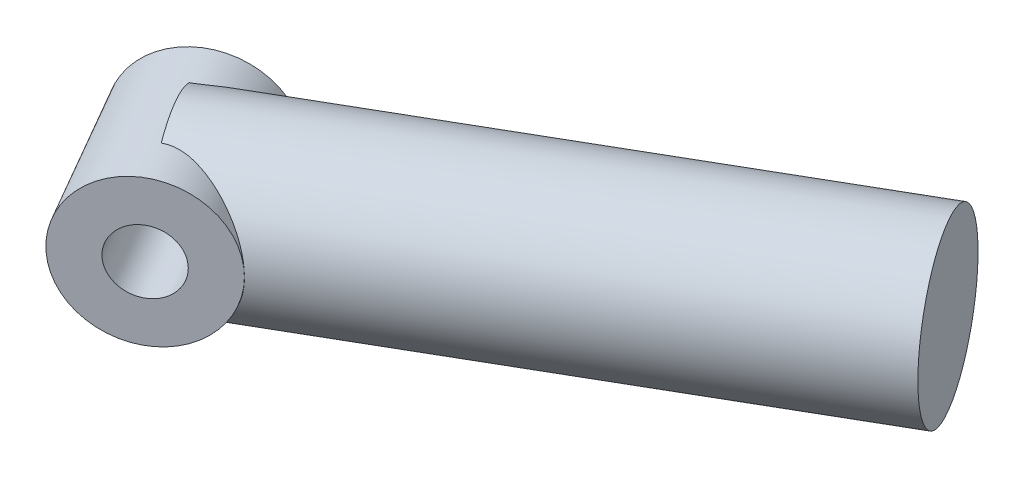
ISO-10303-21;
HEADER;
FILE_DESCRIPTION(('STEP AP214'),'2;1');
FILE_NAME('part.step','',(''),(''),'','','');
FILE_SCHEMA(('AUTOMOTIVE_DESIGN { 1 0 10303 214 1 1 1 1 }'));
ENDSEC;
DATA;
#1=APPLICATION_CONTEXT('core data for automotive mechanical design processes');
#2=APPLICATION_PROTOCOL_DEFINITION('international standard','automotive_design',2000,#1);
#3=PRODUCT_CONTEXT('',#1,'mechanical');
#4=PRODUCT('Part','Part','',(#3));
#5=PRODUCT_RELATED_PRODUCT_CATEGORY('part','',(#4));
#6=PRODUCT_DEFINITION_FORMATION('','',#4);
#7=PRODUCT_DEFINITION_CONTEXT('part definition',#1,'design');
#8=PRODUCT_DEFINITION('design','',#6,#7);
#9=PRODUCT_DEFINITION_SHAPE('','',#8);
#10=(LENGTH_UNIT() NAMED_UNIT(*) SI_UNIT(.MILLI.,.METRE.));
#11=(NAMED_UNIT(*) PLANE_ANGLE_UNIT() SI_UNIT($,.RADIAN.));
#12=(NAMED_UNIT(*) SI_UNIT($,.STERADIAN.) SOLID_ANGLE_UNIT());
#13=UNCERTAINTY_MEASURE_WITH_UNIT(LENGTH_MEASURE(1.E-05),#10,'distance_accuracy_value','');
#14=(GEOMETRIC_REPRESENTATION_CONTEXT(3) GLOBAL_UNCERTAINTY_ASSIGNED_CONTEXT((#13)) GLOBAL_UNIT_ASSIGNED_CONTEXT((#10,
#11,#12)) REPRESENTATION_CONTEXT('',''));
#15=CARTESIAN_POINT('',(0.,0.,0.));
#16=DIRECTION('',(0.,0.,1.));
#17=DIRECTION('',(1.,0.,0.));
#18=AXIS2_PLACEMENT_3D('',#15,#16,#17);
#19=CARTESIAN_POINT('',(-9.10275389905986,0.,5.25547741398914));
#20=DIRECTION('',(0.866025403784438,0.,-0.5));
#21=DIRECTION('',(-0.5,0.,-0.866025403784439));
#22=AXIS2_PLACEMENT_3D('',#19,#20,#21);
#23=CYLINDRICAL_SURFACE('',#22,13.);
#24=CARTESIAN_POINT('',(77.499786479384,0.,-44.7445225860109));
#25=DIRECTION('',(-0.866025403784439,0.,0.5));
#26=DIRECTION('',(0.5,0.,0.866025403784439));
#27=AXIS2_PLACEMENT_3D('',#24,#25,#26);
#28=CIRCLE('',#27,13.);
#29=CARTESIAN_POINT('',(83.999786479384,0.,-33.4861923368132));
#30=VERTEX_POINT('',#29);
#31=EDGE_CURVE('E12',#30,#30,#28,.T.);
#32=ORIENTED_EDGE('',*,*,#31,.T.);
#33=EDGE_LOOP('',(#32));
#34=FACE_BOUND('',#33,.T.);
#35=CARTESIAN_POINT('',(0.,0.,0.));
#36=DIRECTION('',(-0.866025403784438,0.,0.5));
#37=DIRECTION('',(0.5,0.,0.866025403784439));
#38=AXIS2_PLACEMENT_3D('',#35,#36,#37);
#39=CIRCLE('',#38,13.);
#40=CARTESIAN_POINT('',(3.03108891324554,11.5,5.25000000000003));
#41=VERTEX_POINT('',#40);
#42=CARTESIAN_POINT('',(-3.03108891324555,11.5,-5.25000000000001));
#43=VERTEX_POINT('',#42);
#44=EDGE_CURVE('E86',#41,#43,#39,.T.);
#45=ORIENTED_EDGE('',*,*,#44,.F.);
#46=CARTESIAN_POINT('',(-3.45929214352104,0.,17.0083302491977));
#47=CARTESIAN_POINT('',(-3.4592924567998,-0.268208148853987,17.0083313760094));
#48=CARTESIAN_POINT('',(-3.4553110386944,-0.536406399814329,16.9964292484813));
#49=CARTESIAN_POINT('',(-3.43945371948456,-1.07046604302831,16.9490879936389));
#50=CARTESIAN_POINT('',(-3.42757814878374,-1.33632753261342,16.9136498514065));
#51=CARTESIAN_POINT('',(-3.39612107856812,-1.86359618282636,16.8199847794449));
#52=CARTESIAN_POINT('',(-3.37653749163683,-2.12500211681669,16.7617516766104));
#53=CARTESIAN_POINT('',(-3.32995793893345,-2.64135001033042,16.6236746924147));
#54=CARTESIAN_POINT('',(-3.30296173704058,-2.89629176366175,16.5438301226448));
#55=CARTESIAN_POINT('',(-3.2421068034695,-3.39652549013042,16.3645728264938));
#56=CARTESIAN_POINT('',(-3.20829146521807,-3.64186731866045,16.2652839435076));
#57=CARTESIAN_POINT('',(-3.13408088379274,-4.12328563814977,16.0484764705984));
#58=CARTESIAN_POINT('',(-3.09368582562738,-4.35936238939294,15.9309583932482));
#59=CARTESIAN_POINT('',(-3.00668438621416,-4.82136781377201,15.6793859448522));
#60=CARTESIAN_POINT('',(-2.9600769079474,-5.04729468515083,15.5453286535446));
#61=CARTESIAN_POINT('',(-2.86099336599127,-5.48834398600002,15.262394022289));
#62=CARTESIAN_POINT('',(-2.80851599831205,-5.70346399929597,15.1135133901617));
#63=CARTESIAN_POINT('',(-2.67636860883273,-6.20439585243867,14.7417933250582));
#64=CARTESIAN_POINT('',(-2.59408801096472,-6.48496776644131,14.5127938284824));
#65=CARTESIAN_POINT('',(-2.41926263635864,-7.02385172957326,14.033482759551));
#66=CARTESIAN_POINT('',(-2.32671414762171,-7.28215566812834,13.7831634874198));
#67=CARTESIAN_POINT('',(-2.13132857346615,-7.77693328373091,13.264452598407));
#68=CARTESIAN_POINT('',(-2.02846889912511,-8.0133567490091,12.9960217437377));
#69=CARTESIAN_POINT('',(-1.81239631751431,-8.46386738728142,12.4450852274234));
#70=CARTESIAN_POINT('',(-1.69918478775529,-8.67795752405513,12.1625814407196));
#71=CARTESIAN_POINT('',(-1.45894589955112,-9.08863799994956,11.5802588842453));
#72=CARTESIAN_POINT('',(-1.33166692588673,-9.2847321801254,11.2801945729237));
#73=CARTESIAN_POINT('',(-1.0637681193462,-9.65416933040396,10.6719786705798));
#74=CARTESIAN_POINT('',(-0.923144293663003,-9.82750545403943,10.3638246791845));
#75=CARTESIAN_POINT('',(-0.626165609045491,-10.1510105827257,9.74382146131982));
#76=CARTESIAN_POINT('',(-0.469840838181241,-10.3012225524541,9.4319802760194));
#77=CARTESIAN_POINT('',(-0.137156436258614,-10.5782935091054,8.80872071362538));
#78=CARTESIAN_POINT('',(0.0391886345687564,-10.7051692940772,8.49730219384063));
#79=CARTESIAN_POINT('',(0.32494948612989,-10.8779189055812,8.03285161567242));
#80=CARTESIAN_POINT('',(0.424641459184684,-10.9329475222795,7.87722972749962));
#81=CARTESIAN_POINT('',(0.631842766479166,-11.0363192537515,7.56901498643692));
#82=CARTESIAN_POINT('',(0.739353373010387,-11.0846612767146,7.41642263169551));
#83=CARTESIAN_POINT('',(1.07512762750838,-11.2189378323054,6.96568839854523));
#84=CARTESIAN_POINT('',(1.31702797580375,-11.2943703314161,6.67392117558157));
#85=CARTESIAN_POINT('',(1.69121341708012,-11.3780205536317,6.28473251218227));
#86=CARTESIAN_POINT('',(1.80561350210564,-11.3998370700477,6.17281400009827));
#87=CARTESIAN_POINT('',(2.04236198276775,-11.4372951591975,5.9566488000601));
#88=CARTESIAN_POINT('',(2.16470632390325,-11.4529398534347,5.85239825566373));
#89=CARTESIAN_POINT('',(2.41708366465755,-11.4777016331119,5.65319006320924));
#90=CARTESIAN_POINT('',(2.54710478998098,-11.4868285278792,5.55821863677583));
#91=CARTESIAN_POINT('',(2.81444006107079,-11.4983627459279,5.37868225254061));
#92=CARTESIAN_POINT('',(2.95175403358948,-11.500770228762,5.29411704768844));
#93=CARTESIAN_POINT('',(3.23291156364106,-11.4987977965187,5.13611079431786));
#94=CARTESIAN_POINT('',(3.37676629066826,-11.4944058126082,5.06268978050098));
#95=CARTESIAN_POINT('',(3.66945538359646,-11.4789312583571,4.92742172022281));
#96=CARTESIAN_POINT('',(3.81828989723716,-11.4678484893484,4.86557501750632));
#97=CARTESIAN_POINT('',(4.11977286287667,-11.4392402244615,4.75303886392319));
#98=CARTESIAN_POINT('',(4.27242724989742,-11.4217040371525,4.70236815249013));
#99=CARTESIAN_POINT('',(4.58003826365726,-11.380549774741,4.61150840633436));
#100=CARTESIAN_POINT('',(4.73499572472266,-11.3569294423257,4.57132327308796));
#101=CARTESIAN_POINT('',(5.1306197154448,-11.2896044427612,4.48110996558831));
#102=CARTESIAN_POINT('',(5.37210719431803,-11.2419604391633,4.43759785166319));
#103=CARTESIAN_POINT('',(5.85492928141631,-11.1343816342632,4.36877954852815));
#104=CARTESIAN_POINT('',(6.09626369107851,-11.0744389384851,4.34348510042979));
#105=CARTESIAN_POINT('',(6.57770803548093,-10.9430219956843,4.30713738835255));
#106=CARTESIAN_POINT('',(6.81781071792712,-10.8715080833192,4.29613432925461));
#107=CARTESIAN_POINT('',(7.29472885647581,-10.7177861415263,4.28529774884267));
#108=CARTESIAN_POINT('',(7.53154462802083,-10.6355791462702,4.28546314818198));
#109=CARTESIAN_POINT('',(8.16604492302522,-10.3995579350973,4.29744839319644));
#110=CARTESIAN_POINT('',(8.55997526662449,-10.2359823535996,4.31736683834759));
#111=CARTESIAN_POINT('',(9.33356793890672,-9.87995949908995,4.3727930304901));
#112=CARTESIAN_POINT('',(9.71322101788741,-9.68749389898744,4.40831070097736));
#113=CARTESIAN_POINT('',(10.4552446260013,-9.2739555655402,4.48887211699072));
#114=CARTESIAN_POINT('',(10.8176264317766,-9.05290185786119,4.53390953956312));
#115=CARTESIAN_POINT('',(11.5222073612422,-8.58186549651693,4.62915691710904));
#116=CARTESIAN_POINT('',(11.8644153765926,-8.33189573379607,4.67936456607801));
#117=CARTESIAN_POINT('',(12.4576291221535,-7.85661485615911,4.77118471083815));
#118=CARTESIAN_POINT('',(12.7129988577289,-7.63667601019217,4.81246119304705));
#119=CARTESIAN_POINT('',(13.2064427288721,-7.17805497991264,4.894754639572));
#120=CARTESIAN_POINT('',(13.4445168141448,-6.93937274109903,4.93577160313307));
#121=CARTESIAN_POINT('',(13.9003817656948,-6.44374062066527,5.01616667816283));
#122=CARTESIAN_POINT('',(14.1182031323339,-6.18681927092179,5.05554720294258));
#123=CARTESIAN_POINT('',(14.5309759420904,-5.65481648809356,5.13149670168681));
#124=CARTESIAN_POINT('',(14.7259326726025,-5.37973927659502,5.16806632498907));
#125=CARTESIAN_POINT('',(15.0527908797031,-4.86994057439455,5.23019189519631));
#126=CARTESIAN_POINT('',(15.1894595141398,-4.63835848090657,5.25647683831854));
#127=CARTESIAN_POINT('',(15.4444588889354,-4.16500844362176,5.30593315580074));
#128=CARTESIAN_POINT('',(15.5627936026078,-3.92324272129919,5.3291052046397));
#129=CARTESIAN_POINT('',(15.7793816678935,-3.43062976041046,5.37179047791057));
#130=CARTESIAN_POINT('',(15.8776414399183,-3.17978545568412,5.39130487197619));
#131=CARTESIAN_POINT('',(16.0524962117216,-2.67034348149763,5.42619448711392));
#132=CARTESIAN_POINT('',(16.1290909589342,-2.4117457216884,5.44156965993186));
#133=CARTESIAN_POINT('',(16.2596013639931,-1.88692788809372,5.46784944410117));
#134=CARTESIAN_POINT('',(16.3133729583577,-1.62067040149803,5.47872564657481));
#135=CARTESIAN_POINT('',(16.3964501765854,-1.08419437409467,5.49555718067112));
#136=CARTESIAN_POINT('',(16.4257557455658,-0.813975824402825,5.50151250125515));
#137=CARTESIAN_POINT('',(16.4592686434703,-0.2719942457227,5.50832441807198));
#138=CARTESIAN_POINT('',(16.4634830266846,-0.000231672340276123,5.50918244738841));
#139=CARTESIAN_POINT('',(16.4467375846748,0.542470215715597,5.50577710946885));
#140=CARTESIAN_POINT('',(16.4257795393063,0.813409587236907,5.50151410432353));
#141=CARTESIAN_POINT('',(16.3624483931876,1.32545460184483,5.48866527991781));
#142=CARTESIAN_POINT('',(16.3223954018476,1.56686331740948,5.48054811142011));
#143=CARTESIAN_POINT('',(16.2229065143583,2.04546226563841,5.46045417123648));
#144=CARTESIAN_POINT('',(16.16347217021,2.28265283447611,5.44847770859226));
#145=CARTESIAN_POINT('',(16.0261630658482,2.75139222995259,5.42093644115328));
#146=CARTESIAN_POINT('',(15.9482890163271,2.98294127364457,5.40537177465362));
#147=CARTESIAN_POINT('',(15.77520460625,3.43929145808351,5.37098224209813));
#148=CARTESIAN_POINT('',(15.6799876984988,3.66409001295626,5.35215614493377));
#149=CARTESIAN_POINT('',(15.4682078851546,4.1171700132519,5.31059098899597));
#150=CARTESIAN_POINT('',(15.3508040404584,4.34504446462689,5.287701344014));
#151=CARTESIAN_POINT('',(15.0997330239758,4.79138614348131,5.23921957736918));
#152=CARTESIAN_POINT('',(14.9660595313386,5.00984966984839,5.21362640588425));
#153=CARTESIAN_POINT('',(14.5429045275077,5.65007968977576,5.13354177502568));
#154=CARTESIAN_POINT('',(14.2311571598763,6.05696078820165,5.07571895483106));
#155=CARTESIAN_POINT('',(13.6417024571066,6.73381769541106,4.97016222849758));
#156=CARTESIAN_POINT('',(13.3741595987999,7.01302113800387,4.92339536470355));
#157=CARTESIAN_POINT('',(12.8155505702713,7.5469724725827,4.82915574940637));
#158=CARTESIAN_POINT('',(12.5244738979235,7.80170933400383,4.78168269055623));
#159=CARTESIAN_POINT('',(11.9212958542353,8.28755545861183,4.68803018112752));
#160=CARTESIAN_POINT('',(11.6091194856841,8.5185722000103,4.64185627088315));
#161=CARTESIAN_POINT('',(10.9676774662456,8.95616575912906,4.5535396393271));
#162=CARTESIAN_POINT('',(10.6384154792331,9.16274778577394,4.51139605920894));
#163=CARTESIAN_POINT('',(9.95741205899909,9.55625361781802,4.43343272365152));
#164=CARTESIAN_POINT('',(9.60532817725096,9.74261758495449,4.39778026164067));
#165=CARTESIAN_POINT('',(8.88766445737441,10.0902453852034,4.33859864091633));
#166=CARTESIAN_POINT('',(8.52207616572871,10.2514931549626,4.31507721870801));
#167=CARTESIAN_POINT('',(7.781357241373,10.547604590315,4.28684859549096));
#168=CARTESIAN_POINT('',(7.40627254850092,10.6825750580304,4.28206365723829));
#169=CARTESIAN_POINT('',(6.64822943154419,10.92536793482,4.30074326140753));
#170=CARTESIAN_POINT('',(6.26528422775914,11.0332324387148,4.3241636698909));
#171=CARTESIAN_POINT('',(5.71206551845513,11.166865739231,4.38826855299626));
#172=CARTESIAN_POINT('',(5.54271218384289,11.2047952991101,4.41195566267643));
#173=CARTESIAN_POINT('',(5.20432224687949,11.2744163827037,4.46899785007049));
#174=CARTESIAN_POINT('',(5.03528561470595,11.3061085263784,4.5023519661287));
#175=CARTESIAN_POINT('',(4.69903775756426,11.3627263640578,4.5800925332192));
#176=CARTESIAN_POINT('',(4.53182304458747,11.3876686482355,4.62445141163896));
#177=CARTESIAN_POINT('',(4.20025861707373,11.4303958537691,4.72555471963096));
#178=CARTESIAN_POINT('',(4.03590804842521,11.4481829450538,4.78229538616052));
#179=CARTESIAN_POINT('',(3.70958714956583,11.4763481260492,4.90992106312632));
#180=CARTESIAN_POINT('',(3.54767639227765,11.4866258845821,4.980981982056));
#181=CARTESIAN_POINT('',(3.23036542816845,11.4990725411167,5.13699632147027));
#182=CARTESIAN_POINT('',(3.07496458307924,11.5012422359269,5.2219483759667));
#183=CARTESIAN_POINT('',(2.77221171993505,11.497401773935,5.40515267295904));
#184=CARTESIAN_POINT('',(2.62486397797074,11.4913873145166,5.50341188690368));
#185=CARTESIAN_POINT('',(2.33937741498203,11.4713652843462,5.71176950358742));
#186=CARTESIAN_POINT('',(2.20124015742337,11.4573563603844,5.82186990810421));
#187=CARTESIAN_POINT('',(1.91496570877611,11.419118087091,6.06894027005355));
#188=CARTESIAN_POINT('',(1.76834818878449,11.3936881275048,6.20748005411781));
#189=CARTESIAN_POINT('',(1.48732343793773,11.3335624016528,6.49467602788706));
#190=CARTESIAN_POINT('',(1.35292628894598,11.2988590761278,6.64334039672887));
#191=CARTESIAN_POINT('',(1.09499982710623,11.220817112415,6.94842280237071));
#192=CARTESIAN_POINT('',(0.971505857105246,11.1774517786061,7.10486365743777));
#193=CARTESIAN_POINT('',(0.734580061877175,11.0827994196711,7.4227550066282));
#194=CARTESIAN_POINT('',(0.621146113197205,11.0315140725836,7.58420443379232));
#195=CARTESIAN_POINT('',(0.316948262312253,10.878150964584,8.0388794189797));
#196=CARTESIAN_POINT('',(0.135671891760032,10.7678903815487,8.33570874484138));
#197=CARTESIAN_POINT('',(-0.205693951473009,10.5253190793308,8.932573129929));
#198=CARTESIAN_POINT('',(-0.365766899134592,10.3929913412947,9.23261049484124));
#199=CARTESIAN_POINT('',(-0.669446113785198,10.1069051478147,9.83140854992885));
#200=CARTESIAN_POINT('',(-0.813027949557769,9.95311562513615,10.1301667304123));
#201=CARTESIAN_POINT('',(-1.08651436886273,9.62455765682868,10.7221990041694));
#202=CARTESIAN_POINT('',(-1.21642272425545,9.4497950252982,11.0154745913739));
#203=CARTESIAN_POINT('',(-1.47473362665075,9.0640675608851,11.617081058303));
#204=CARTESIAN_POINT('',(-1.60215079718531,8.85131314418331,11.9246912676776));
#205=CARTESIAN_POINT('',(-1.84488061020276,8.40080054276573,12.5262212136549));
#206=CARTESIAN_POINT('',(-1.96019085068544,8.16303741501243,12.8201382271341));
#207=CARTESIAN_POINT('',(-2.17910043072258,7.66276398945184,13.3896745992554));
#208=CARTESIAN_POINT('',(-2.28272355366396,7.40030601934952,13.6653306292463));
#209=CARTESIAN_POINT('',(-2.47853680880274,6.85018090299923,14.1946342816362));
#210=CARTESIAN_POINT('',(-2.57073139094414,6.56252364355966,14.4482904585155));
#211=CARTESIAN_POINT('',(-2.72009915501713,6.04285782223246,14.8643933869389));
#212=CARTESIAN_POINT('',(-2.78003483588674,5.81660604455808,15.0330611476171));
#213=CARTESIAN_POINT('',(-2.89321548247849,5.35120319355685,15.3540134812256));
#214=CARTESIAN_POINT('',(-2.94646213138631,5.11205538704058,15.5063021742878));
#215=CARTESIAN_POINT('',(-3.04585480365828,4.62157880149385,15.792337872151));
#216=CARTESIAN_POINT('',(-3.09200313139486,4.37025401054329,15.9260908929009));
#217=CARTESIAN_POINT('',(-3.17675510481624,3.85638715031863,16.1729343352467));
#218=CARTESIAN_POINT('',(-3.21535875590487,3.59384508907899,16.286024771642));
#219=CARTESIAN_POINT('',(-3.28407326003994,3.06258454448539,16.4880701903005));
#220=CARTESIAN_POINT('',(-3.31429039912841,2.79399493154601,16.5773266235163));
#221=CARTESIAN_POINT('',(-3.36646414142429,2.24918838397126,16.7318331206651));
#222=CARTESIAN_POINT('',(-3.38842095622899,1.97297164490771,16.7970837995311));
#223=CARTESIAN_POINT('',(-3.42369930733547,1.41533827570263,16.9020813140654));
#224=CARTESIAN_POINT('',(-3.43702594744419,1.13392482032648,16.9418432234196));
#225=CARTESIAN_POINT('',(-3.45482193732644,0.568337096804542,16.9949663123725));
#226=CARTESIAN_POINT('',(-3.45929181160632,0.284162993148702,17.0083290553556));
#227=CARTESIAN_POINT('',(-3.45929214352104,0.,17.0083302491977));
#228=B_SPLINE_CURVE_WITH_KNOTS('',3,(#46,#47,#48,#49,#50,#51,#52,#53,#54,#55,#56,#57,#58,#59,
#60,#61,#62,#63,#64,#65,#66,#67,#68,#69,#70,#71,#72,#73,#74,#75,#76,#77,#78,#79,#80,#81,#82,#83,
#84,#85,#86,#87,#88,#89,#90,#91,#92,#93,#94,#95,#96,#97,#98,#99,#100,#101,#102,#103,#104,#105,
#106,#107,#108,#109,#110,#111,#112,#113,#114,#115,#116,#117,#118,#119,#120,#121,#122,#123,#124,
#125,#126,#127,#128,#129,#130,#131,#132,#133,#134,#135,#136,#137,#138,#139,#140,#141,#142,#143,
#144,#145,#146,#147,#148,#149,#150,#151,#152,#153,#154,#155,#156,#157,#158,#159,#160,#161,#162,
#163,#164,#165,#166,#167,#168,#169,#170,#171,#172,#173,#174,#175,#176,#177,#178,#179,#180,#181,
#182,#183,#184,#185,#186,#187,#188,#189,#190,#191,#192,#193,#194,#195,#196,#197,#198,#199,#200,
#201,#202,#203,#204,#205,#206,#207,#208,#209,#210,#211,#212,#213,#214,#215,#216,#217,#218,#219,
#220,#221,#222,#223,#224,#225,#226,#227),.UNSPECIFIED.,.T.,.F.,(4,2,2,2,2,2,2,2,2,2,2,2,2,2,2,2,
2,2,2,2,2,2,2,2,2,2,2,2,2,2,2,2,2,2,2,2,2,2,2,2,2,2,2,2,2,2,2,2,2,2,2,2,2,2,2,2,2,2,2,2,2,2,2,2,
2,2,2,2,2,2,2,2,2,2,2,2,2,2,2,2,2,2,2,2,2,2,2,2,2,2,4),(0.,0.804317078905841,1.60860049586556,
2.41310187174343,3.2176288771098,4.01718927843597,4.81672720160468,5.61640649851525,
6.416263797497,7.52880515492207,8.64175003167463,9.75718867560461,10.8724791046742,
12.0126177694267,13.1530986480664,14.2914342508361,15.4289472127462,16.0071644120819,
16.5854759135841,17.7396685490095,18.2238454584996,18.7077771724141,19.1909790224409,
19.6741693987326,20.1582184060875,20.6422817869052,21.127150756515,21.612199879848,
22.3608069115569,23.1098959826557,23.861609508894,24.6132503878325,25.8924568015764,
27.1724781678517,28.4516520093433,29.7302577696353,30.7480297495706,31.7658046890377,
32.7820211657698,33.798002179468,34.6077967246798,35.417415525599,36.2267749857264,
37.036143880787,37.8505482907816,38.6649545276628,39.4791317865557,40.2932514811737,
41.0269450302996,41.7605798418461,42.4941863826609,43.2280704473967,43.9993795962416,
44.770989365367,46.3132990932264,47.4804623352382,48.6481493375756,49.8202305298272,
50.9920614090167,52.1907807726309,53.3902636706651,54.5847646351837,55.7773989462735,
56.3025735955587,56.8276960193745,57.3515157981528,57.8751766000804,58.405712040956,
58.9361953428409,59.4669576409573,59.9978098069941,60.606777879845,61.2162438802884,
61.8276180217161,62.4388628066099,63.531692580717,64.625369109257,65.7206455475453,
66.8156190551293,67.9998217658487,69.1842589787505,70.3662406197154,71.5477605757953,
72.4125140283781,73.2770494421379,74.1413036013,75.0055571414436,75.8582975363849,
76.711016085954,77.5632298838706,78.4153932113425),.UNSPECIFIED.);
#229=CARTESIAN_POINT('',(16.4592921435211,0.,5.50833024919782));
#230=VERTEX_POINT('',#229);
#231=EDGE_CURVE('E45',#230,#41,#228,.T.);
#232=ORIENTED_EDGE('',*,*,#231,.F.);
#233=CARTESIAN_POINT('',(3.03108891324554,-11.5,5.25000000000002));
#234=VERTEX_POINT('',#233);
#235=EDGE_CURVE('E85',#234,#230,#228,.T.);
#236=ORIENTED_EDGE('',*,*,#235,.F.);
#237=CARTESIAN_POINT('',(0.,0.,0.));
#238=DIRECTION('',(-0.866025403784438,0.,0.5));
#239=DIRECTION('',(0.5,0.,0.866025403784439));
#240=AXIS2_PLACEMENT_3D('',#237,#238,#239);
#241=CIRCLE('',#240,13.);
#242=CARTESIAN_POINT('',(-3.03108891324555,-11.5,-5.25000000000001));
#243=VERTEX_POINT('',#242);
#244=EDGE_CURVE('E75',#243,#234,#241,.T.);
#245=ORIENTED_EDGE('',*,*,#244,.F.);
#246=CARTESIAN_POINT('',(-16.459292143521,0.,-5.50833024919759));
#247=CARTESIAN_POINT('',(-16.459293276008,0.26820814885399,-5.50833054129609));
#248=CARTESIAN_POINT('',(-16.4469950221568,0.536406399814336,-5.50582748675444));
#249=CARTESIAN_POINT('',(-16.3980676332114,1.07046604302832,-5.49588970060497));
#250=CARTESIAN_POINT('',(-16.3614395164248,1.33632753261343,-5.48845517540005));
#251=CARTESIAN_POINT('',(-16.2645946495509,1.86359618282637,-5.4688652613546));
#252=CARTESIAN_POINT('',(-16.2043715096894,2.1250021168167,-5.45670859371709));
#253=CARTESIAN_POINT('',(-16.0615035573463,2.64135001033042,-5.42800917755728));
#254=CARTESIAN_POINT('',(-15.9788580306249,2.89629176366175,-5.41146628931728));
#255=CARTESIAN_POINT('',(-15.7931891915589,3.39652549013042,-5.37453955965994));
#256=CARTESIAN_POINT('',(-15.6902948274537,3.64186731866045,-5.35418006013013));
#257=CARTESIAN_POINT('',(-15.4654287574714,4.12328563814978,-5.31004457241947));
#258=CARTESIAN_POINT('',(-15.3434575879996,4.35936238939293,-5.28626868030295));
#259=CARTESIAN_POINT('',(-15.0820887370898,4.82136781377201,-5.23582791280261));
#260=CARTESIAN_POINT('',(-14.9426879781214,5.04729468515083,-5.20916252733413));
#261=CARTESIAN_POINT('',(-14.6481176288657,5.48834398600002,-5.1535040761373));
#262=CARTESIAN_POINT('',(-14.4929445354723,5.70346399929597,-5.12451049360757));
#263=CARTESIAN_POINT('',(-14.1049518212566,6.20439585243867,-5.05309345738871));
#264=CARTESIAN_POINT('',(-13.8654921408341,6.48496776644131,-5.00985079709307));
#265=CARTESIAN_POINT('',(-13.3629838915214,7.02385172957327,-4.92159847826239));
#266=CARTESIAN_POINT('',(-13.0999267984305,7.28215566812835,-4.87658818452481));
#267=CARTESIAN_POINT('',(-12.553017204248,7.77693328373091,-4.78644161077014));
#268=CARTESIAN_POINT('',(-12.2691194277744,8.0133567490091,-4.74130527443985));
#269=CARTESIAN_POINT('',(-11.6839581179682,8.46386738728142,-4.6529613610189));
#270=CARTESIAN_POINT('',(-11.382696897138,8.67795752405513,-4.60975352843964));
#271=CARTESIAN_POINT('',(-10.7582713259325,9.08863799994956,-4.52664523036424));
#272=CARTESIAN_POINT('',(-10.4347685227266,9.2847321801254,-4.48683989926439));
#273=CARTESIAN_POINT('',(-9.77408869704086,9.65416933040396,-4.41473912020006));
#274=CARTESIAN_POINT('',(-9.43690759937339,9.82750545403943,-4.38244592992143));
#275=CARTESIAN_POINT('',(-8.75147971996572,10.1510105827257,-4.32963540625034));
#276=CARTESIAN_POINT('',(-8.40325494611718,10.3012225524541,-4.30909603640935));
#277=CARTESIAN_POINT('',(-7.69715413097107,10.5782935091054,-4.28557939872017));
#278=CARTESIAN_POINT('',(-7.33928524621485,10.7051692940772,-4.28258944999647));
#279=CARTESIAN_POINT('',(-6.79417882093823,10.8779189055812,-4.29784031777137));
#280=CARTESIAN_POINT('',(-6.6095603258683,10.9329475222795,-4.30636515490382));
#281=CARTESIAN_POINT('',(-6.23903787663991,11.0363192537515,-4.33169938018683));
#282=CARTESIAN_POINT('',(-6.05313371774495,11.0846612767146,-4.34851011924844));
#283=CARTESIAN_POINT('',(-5.49489929423252,11.2189378323054,-4.41393203700535));
#284=CARTESIAN_POINT('',(-5.12127129300667,11.2943703314161,-4.47754027233162));
#285=CARTESIAN_POINT('',(-4.59713130299978,11.3780205536317,-4.60700003850359));
#286=CARTESIAN_POINT('',(-4.44300698586851,11.3998370700477,-4.65011416228879));
#287=CARTESIAN_POINT('',(-4.13742819089026,11.4372951591975,-4.74706176083046));
#288=CARTESIAN_POINT('',(-3.9859724005169,11.4529398534347,-4.80088979606489));
#289=CARTESIAN_POINT('',(-3.68726437483217,11.4777016331119,-4.91985088827043));
#290=CARTESIAN_POINT('',(-3.54000614424548,11.4868285278792,-4.98496677261245));
#291=CARTESIAN_POINT('',(-3.25085543904927,11.4983627459279,-5.12671771658622));
#292=CARTESIAN_POINT('',(-3.10896283711172,11.500770228762,-5.20335250265589));
#293=CARTESIAN_POINT('',(-2.83154664271021,11.4987977965187,-5.36783893946055));
#294=CARTESIAN_POINT('',(-2.69603481605957,11.4944058126082,-5.45571028061214));
#295=CARTESIAN_POINT('',(-2.43254469307393,11.4789312583571,-5.6415524403595));
#296=CARTESIAN_POINT('',(-2.30456662056079,11.4678484893484,-5.739523558774));
#297=CARTESIAN_POINT('',(-2.05636596989386,11.4392402244615,-5.94434738903452));
#298=CARTESIAN_POINT('',(-1.93615665305464,11.4217040371525,-6.0512146104771));
#299=CARTESIAN_POINT('',(-1.70366429782241,11.380549774741,-6.27218368979913));
#300=CARTESIAN_POINT('',(-1.59138422104387,11.3569294423257,-6.3862882209645));
#301=CARTESIAN_POINT('',(-1.31544520962868,11.2896044427612,-6.68380199352663));
#302=CARTESIAN_POINT('',(-1.15701887416056,11.2419604391633,-6.87118022796414));
#303=CARTESIAN_POINT('',(-0.856009431851134,11.1343816342632,-7.25490726933196));
#304=CARTESIAN_POINT('',(-0.713436592392145,11.0744389384851,-7.45126177485756));
#305=CARTESIAN_POINT('',(-0.441236378162602,10.9430219956843,-7.85003095157979));
#306=CARTESIAN_POINT('',(-0.311656108241345,10.8715080833192,-8.052464444546));
#307=CARTESIAN_POINT('',(-0.063812285040111,10.7177861415263,-8.46006937784879));
#308=CARTESIAN_POINT('',(0.0544523607027808,10.6355791462702,-8.66524055169324));
#309=CARTESIAN_POINT('',(0.361322981551873,10.3995579350973,-9.22072654838299));
#310=CARTESIAN_POINT('',(0.541038273846729,10.2359823535996,-9.57183945583707));
#311=CARTESIAN_POINT('',(0.879834119557395,9.87995949908995,-10.2695034582862));
#312=CARTESIAN_POINT('',(1.03890145412253,9.68749389898744,-10.6160515045521));
#313=CARTESIAN_POINT('',(1.34014502534707,9.27395556554019,-11.2989435073932));
#314=CARTESIAN_POINT('',(1.48233237616602,9.05290185786118,-11.6352940683501));
#315=CARTESIAN_POINT('',(1.75213619230024,8.58186549651693,-12.2931027410624));
#316=CARTESIAN_POINT('',(1.87975910050398,8.33189573379607,-12.6145674002189));
#317=CARTESIAN_POINT('',(2.09684739534299,7.85661485615911,-13.1742156461288));
#318=CARTESIAN_POINT('',(2.18878578095892,7.63667601019216,-13.4160105655993));
#319=CARTESIAN_POINT('',(2.36423950127498,7.17805497991264,-13.8844922166136));
#320=CARTESIAN_POINT('',(2.44775481148132,6.93937274109903,-14.1111789042229));
#321=CARTESIAN_POINT('',(2.60606310994141,6.44374062066527,-14.5461670704751));
#322=CARTESIAN_POINT('',(2.68086925838733,6.18681927092178,-14.7544961698615));
#323=CARTESIAN_POINT('',(2.82148146794835,5.65481648809356,-15.1499426584742));
#324=CARTESIAN_POINT('',(2.88728961041782,5.37973927659502,-15.3370649513875));
#325=CARTESIAN_POINT('',(2.99691639194407,4.86994057439455,-15.6511952472757));
#326=CARTESIAN_POINT('',(3.04248728068153,4.63835848090657,-15.7826962281596));
#327=CARTESIAN_POINT('',(3.12715654076211,4.16500844362176,-16.0282603234228));
#328=CARTESIAN_POINT('',(3.16625631464604,3.92324272129919,-16.1423272160321));
#329=CARTESIAN_POINT('',(3.23758381626883,3.43062976041046,-16.3512406193615));
#330=CARTESIAN_POINT('',(3.26981374128096,3.17978545568412,-16.4460932751379));
#331=CARTESIAN_POINT('',(3.32702583414505,2.67034348149763,-16.6149667570613));
#332=CARTESIAN_POINT('',(3.35200791750347,2.4117457216884,-16.6889873403529));
#333=CARTESIAN_POINT('',(3.3945041593363,1.88692788809371,-16.8151525586767));
#334=CARTESIAN_POINT('',(3.41197088887972,1.62067040149803,-16.8671582266352));
#335=CARTESIAN_POINT('',(3.43893296188152,1.08419437409467,-16.9475209751443));
#336=CARTESIAN_POINT('',(3.44842828745825,0.813975824402822,-16.9758780026457));
#337=CARTESIAN_POINT('',(3.45928544339868,0.271994245722697,-17.0083069819939));
#338=CARTESIAN_POINT('',(3.46064955982059,0.000231672340272003,-17.0123857595769));
#339=CARTESIAN_POINT('',(3.45522594796252,-0.542470215715601,-16.9961811124391));
#340=CARTESIAN_POINT('',(3.44843879603058,-0.813409587236909,-16.9758994101637));
#341=CARTESIAN_POINT('',(3.42790063131534,-1.32545460184483,-16.9146286165712));
#342=CARTESIAN_POINT('',(3.41490380977118,-1.56686331740948,-16.8758831243244));
#343=CARTESIAN_POINT('',(3.38256122868765,-2.0454622656384,-16.7796762502726));
#344=CARTESIAN_POINT('',(3.36321597751089,-2.2826528344761,-16.7222163670608));
#345=CARTESIAN_POINT('',(3.31841286258454,-2.75139222995258,-16.5895325607931));
#346=CARTESIAN_POINT('',(3.29295523441416,-2.98294127364457,-16.5143093223624));
#347=CARTESIAN_POINT('',(3.23619523819293,-3.43929145808351,-16.3472190599589));
#348=CARTESIAN_POINT('',(3.20489066271576,-3.66409001295626,-16.2553457503943));
#349=CARTESIAN_POINT('',(3.13499723699807,-4.1171700132519,-16.0511564740606));
#350=CARTESIAN_POINT('',(3.09611832868795,-4.34504446462689,-15.9380369395608));
#351=CARTESIAN_POINT('',(3.0125692619814,-4.79138614348131,-15.6963621778104));
#352=CARTESIAN_POINT('',(2.96789685233218,-5.00984966984839,-15.5678009516316));
#353=CARTESIAN_POINT('',(2.82567467519297,-5.65007968977576,-15.1612956531463));
#354=CARTESIAN_POINT('',(2.71987702258426,-6.05696078820165,-14.8624031031172));
#355=CARTESIAN_POINT('',(2.51656447774453,-6.73381769541106,-14.2991419929717));
#356=CARTESIAN_POINT('',(2.42329434069212,-7.01302113800387,-14.04405964918));
#357=CARTESIAN_POINT('',(2.22560372731808,-7.5469724725827,-13.5131702320423));
#358=CARTESIAN_POINT('',(2.12117826610373,-7.80170933400383,-13.237353909915));
#359=CARTESIAN_POINT('',(1.90069469655304,-8.28755545861183,-12.6681601463616));
#360=CARTESIAN_POINT('',(1.78459429154113,-8.5185722000103,-12.3747205256129));
#361=CARTESIAN_POINT('',(1.5403577283261,-8.95616575912906,-11.7750571259464));
#362=CARTESIAN_POINT('',(1.41222414580862,-9.16274778577394,-11.4688360906339));
#363=CARTESIAN_POINT('',(1.1392406648481,-9.55625361781802,-10.8400881608685));
#364=CARTESIAN_POINT('',(0.994074661782885,-9.74261758495448,-10.5173483440061));
#365=CARTESIAN_POINT('',(0.686495588829027,-10.0902453852034,-9.86624252085643));
#366=CARTESIAN_POINT('',(0.524071592171723,-10.2514931549626,-9.53787306186094));
#367=CARTESIAN_POINT('',(0.17815883481369,-10.547604590315,-8.88227734469649));
#368=CARTESIAN_POINT('',(-0.0052396335399973,-10.6825750580304,-8.55505200297225));
#369=CARTESIAN_POINT('',(-0.400438203761563,-10.92536793482,-7.9079072086084));
#370=CARTESIAN_POINT('',(-0.612193474367695,-11.0332324387148,-7.58797713811482));
#371=CARTESIAN_POINT('',(-0.944319286295568,-11.166865739231,-7.14092812356139));
#372=CARTESIAN_POINT('',(-1.04950959232694,-11.2047952991101,-7.00610738841167));
#373=CARTESIAN_POINT('',(-1.26810454417934,-11.2744163827037,-6.74157420031338));
#374=CARTESIAN_POINT('',(-1.38150837209329,-11.3061085263784,-6.61186124071004));
#375=CARTESIAN_POINT('',(-1.61695760666911,-11.3627263640578,-6.3595323380025));
#376=CARTESIAN_POINT('',(-1.73898087875241,-11.3876686482355,-6.23689958788796));
#377=CARTESIAN_POINT('',(-1.99232112563699,-11.4303958537691,-6.00030802466581));
#378=CARTESIAN_POINT('',(-2.12363526860351,-11.4481829450538,-5.88634659035456));
#379=CARTESIAN_POINT('',(-2.39732279646077,-11.4763481260492,-5.66755724063946));
#380=CARTESIAN_POINT('',(-2.53981873611423,-11.4866258845821,-5.56286887114676));
#381=CARTESIAN_POINT('',(-2.83358659945623,-11.4990725411167,-5.36607668503599));
#382=CARTESIAN_POINT('',(-2.98485765929843,-11.5012422359269,-5.27397163266738));
#383=CARTESIAN_POINT('',(-3.29489366614835,-11.497401773935,-5.10338211061221));
#384=CARTESIAN_POINT('',(-3.45366251256246,-11.4913873145166,-5.02490482985316));
#385=CARTESIAN_POINT('',(-3.77684878317691,-11.4713652843462,-4.8818450222077));
#386=CARTESIAN_POINT('',(-3.94126715923473,-11.4573563603844,-4.81726485021119));
#387=CARTESIAN_POINT('',(-4.2983735935287,-11.419118087091,-4.69287908620295));
#388=CARTESIAN_POINT('',(-4.49166132595897,-11.3936881275048,-4.63517448128247));
#389=CARTESIAN_POINT('',(-4.88089271053113,-11.3335624016528,-4.5353978948416));
#390=CARTESIAN_POINT('',(-5.07683840508159,-11.2988590761278,-4.49333873403945));
#391=CARTESIAN_POINT('',(-5.47001074953497,-11.220817112415,-4.42250906859889));
#392=CARTESIAN_POINT('',(-5.6672394892133,-11.1774517786062,-4.39378058089739));
#393=CARTESIAN_POINT('',(-6.06100437086955,-11.0827994196711,-4.34754249801326));
#394=CARTESIAN_POINT('',(-6.25754065056012,-11.0315140725836,-4.33003053038689));
#395=CARTESIAN_POINT('',(-6.80339966364018,-10.878150964584,-4.29392495633758));
#396=CARTESIAN_POINT('',(-7.15109958570071,-10.7678903815487,-4.28534967726435));
#397=CARTESIAN_POINT('',(-7.83868222741729,-10.5253190793308,-4.28815037758406));
#398=CARTESIAN_POINT('',(-8.17855868134662,-10.3929913412947,-4.29954182090658));
#399=CARTESIAN_POINT('',(-8.84897261611451,-10.1069051478147,-4.33594693396166));
#400=CARTESIAN_POINT('',(-9.17949570788786,-9.95311562513615,-4.36098050690232));
#401=CARTESIAN_POINT('',(-9.8289539064743,-9.62455765682867,-4.42015045707276));
#402=CARTESIAN_POINT('',(-10.1478921929995,-9.4497950252982,-4.45428431474104));
#403=CARTESIAN_POINT('',(-10.7980541276388,-9.0640675608851,-4.53138374465679));
#404=CARTESIAN_POINT('',(-11.1281609686879,-8.85131314418332,-4.5748423427828));
#405=CARTESIAN_POINT('',(-11.7704660895501,-8.40080054276573,-4.6653971314425));
#406=CARTESIAN_POINT('',(-12.0826608100688,-8.16303741501243,-4.7124940406076));
#407=CARTESIAN_POINT('',(-12.6853485667237,-7.66276398945185,-4.80768096922431));
#408=CARTESIAN_POINT('',(-12.9758852528728,-7.40030601934952,-4.85576872733302));
#409=CARTESIAN_POINT('',(-13.5321822897278,-6.85018090299923,-4.95084130018008));
#410=CARTESIAN_POINT('',(-13.7979522738028,-6.56252364355966,-4.99782653839402));
#411=CARTESIAN_POINT('',(-14.232991862443,-6.04285782223246,-5.07652172441199));
#412=CARTESIAN_POINT('',(-14.4090302684246,-5.81660604455808,-5.10894978252489));
#413=CARTESIAN_POINT('',(-14.7435734660293,-5.35120319355685,-5.17140863416394));
#414=CARTESIAN_POINT('',(-14.9020826673842,-5.11205538704058,-5.20144003007447));
#415=CARTESIAN_POINT('',(-15.199493184259,-4.62157880149385,-5.25838129986855));
#416=CARTESIAN_POINT('',(-15.3384008619296,-4.37025401054329,-5.28529218608144));
#417=CARTESIAN_POINT('',(-15.5945495404693,-3.85638715031863,-5.33531654525055));
#418=CARTESIAN_POINT('',(-15.7117905568571,-3.59384508907899,-5.35843002092663));
#419=CARTESIAN_POINT('',(-15.9211242742011,-3.06258454448539,-5.39994422406648));
#420=CARTESIAN_POINT('',(-16.0135311823615,-2.79399493154602,-5.41840363059407));
#421=CARTESIAN_POINT('',(-16.17342460509,-2.24918838397127,-5.45047309292975));
#422=CARTESIAN_POINT('',(-16.2409117580044,-1.97297164490772,-5.46408327295565));
#423=CARTESIAN_POINT('',(-16.3494814484787,-1.41533827570265,-5.48603008196101));
#424=CARTESIAN_POINT('',(-16.3905795921368,-1.13392482032649,-5.49436982775688));
#425=CARTESIAN_POINT('',(-16.4454835316386,-0.568337096804548,-5.50551959290974));
#426=CARTESIAN_POINT('',(-16.459290943666,-0.284162993148704,-5.50832993972309));
#427=CARTESIAN_POINT('',(-16.459292143521,0.,-5.50833024919759));
#428=B_SPLINE_CURVE_WITH_KNOTS('',3,(#246,#247,#248,#249,#250,#251,#252,#253,#254,#255,#256,
#257,#258,#259,#260,#261,#262,#263,#264,#265,#266,#267,#268,#269,#270,#271,#272,#273,#274,#275,
#276,#277,#278,#279,#280,#281,#282,#283,#284,#285,#286,#287,#288,#289,#290,#291,#292,#293,#294,
#295,#296,#297,#298,#299,#300,#301,#302,#303,#304,#305,#306,#307,#308,#309,#310,#311,#312,#313,
#314,#315,#316,#317,#318,#319,#320,#321,#322,#323,#324,#325,#326,#327,#328,#329,#330,#331,#332,
#333,#334,#335,#336,#337,#338,#339,#340,#341,#342,#343,#344,#345,#346,#347,#348,#349,#350,#351,
#352,#353,#354,#355,#356,#357,#358,#359,#360,#361,#362,#363,#364,#365,#366,#367,#368,#369,#370,
#371,#372,#373,#374,#375,#376,#377,#378,#379,#380,#381,#382,#383,#384,#385,#386,#387,#388,#389,
#390,#391,#392,#393,#394,#395,#396,#397,#398,#399,#400,#401,#402,#403,#404,#405,#406,#407,#408,
#409,#410,#411,#412,#413,#414,#415,#416,#417,#418,#419,#420,#421,#422,#423,#424,#425,#426,#427),
.UNSPECIFIED.,.T.,.F.,(4,2,2,2,2,2,2,2,2,2,2,2,2,2,2,2,2,2,2,2,2,2,2,2,2,2,2,2,2,2,2,2,2,2,2,2,
2,2,2,2,2,2,2,2,2,2,2,2,2,2,2,2,2,2,2,2,2,2,2,2,2,2,2,2,2,2,2,2,2,2,2,2,2,2,2,2,2,2,2,2,2,2,2,2,
2,2,2,2,2,2,4),(0.,0.804317078905847,1.60860049586556,2.41310187174343,3.2176288771098,
4.01718927843596,4.81672720160467,5.61640649851525,6.416263797497,7.52880515492206,
8.64175003167463,9.7571886756046,10.8724791046742,12.0126177694267,13.1530986480664,
14.2914342508361,15.4289472127462,16.0071644120819,16.5854759135841,17.7396685490095,
18.2238454584996,18.7077771724141,19.1909790224409,19.6741693987326,20.1582184060875,
20.6422817869052,21.127150756515,21.612199879848,22.3608069115569,23.1098959826557,
23.861609508894,24.6132503878325,25.8924568015764,27.1724781678517,28.4516520093433,
29.7302577696353,30.7480297495706,31.7658046890377,32.7820211657698,33.798002179468,
34.6077967246798,35.417415525599,36.2267749857263,37.036143880787,37.8505482907815,
38.6649545276628,39.4791317865557,40.2932514811737,41.0269450302996,41.760579841846,
42.4941863826609,43.2280704473967,43.9993795962416,44.7709893653669,46.3132990932264,
47.4804623352382,48.6481493375755,49.8202305298272,50.9920614090166,52.1907807726309,
53.3902636706651,54.5847646351837,55.7773989462735,56.3025735955587,56.8276960193744,
57.3515157981528,57.8751766000804,58.405712040956,58.9361953428409,59.4669576409573,
59.9978098069941,60.606777879845,61.2162438802884,61.8276180217161,62.4388628066099,
63.5316925807169,64.625369109257,65.7206455475453,66.8156190551293,67.9998217658487,
69.1842589787505,70.3662406197153,71.5477605757952,72.4125140283781,73.2770494421379,
74.1413036013,75.0055571414436,75.8582975363849,76.7110160859539,77.5632298838706,
78.4153932113425),.UNSPECIFIED.);
#429=CARTESIAN_POINT('',(3.45929214352109,0.,-17.0083302491976));
#430=VERTEX_POINT('',#429);
#431=EDGE_CURVE('E83',#430,#243,#428,.T.);
#432=ORIENTED_EDGE('',*,*,#431,.F.);
#433=EDGE_CURVE('E90',#43,#430,#428,.T.);
#434=ORIENTED_EDGE('',*,*,#433,.F.);
#435=EDGE_LOOP('',(#45,#232,#236,#245,#432,#434));
#436=FACE_BOUND('',#435,.T.);
#437=ADVANCED_FACE('F37',(#34,#436),#23,.T.);
#438=CARTESIAN_POINT('',(77.499786479384,0.,-44.7445225860109));
#439=DIRECTION('',(-0.866025403784439,0.,0.5));
#440=DIRECTION('',(0.5,0.,0.866025403784439));
#441=AXIS2_PLACEMENT_3D('',#438,#439,#440);
#442=PLANE('',#441);
#443=ORIENTED_EDGE('',*,*,#31,.F.);
#444=EDGE_LOOP('',(#443));
#445=FACE_BOUND('',#444,.T.);
#446=ADVANCED_FACE('F104',(#445),#442,.F.);
#447=CARTESIAN_POINT('',(6.50000000000006,0.,11.2583302491978));
#448=DIRECTION('',(-0.5,0.,-0.866025403784438));
#449=DIRECTION('',(-0.866025403784438,0.,0.5));
#450=AXIS2_PLACEMENT_3D('',#447,#448,#449);
#451=CYLINDRICAL_SURFACE('',#450,11.5);
#452=ORIENTED_EDGE('',*,*,#231,.T.);
#453=DIRECTION('',(0.5,0.,0.866025403784438));
#454=VECTOR('',#453,1.);
#455=CARTESIAN_POINT('',(-14.,11.5,-24.2487113059642));
#456=LINE('',#455,#454);
#457=EDGE_CURVE('E77',#43,#41,#456,.T.);
#458=ORIENTED_EDGE('',*,*,#457,.F.);
#459=ORIENTED_EDGE('',*,*,#433,.T.);
#460=CARTESIAN_POINT('',(-6.49999999999995,0.,-11.2583302491976));
#461=DIRECTION('',(0.5,0.,0.866025403784439));
#462=DIRECTION('',(0.866025403784439,0.,-0.5));
#463=AXIS2_PLACEMENT_3D('',#460,#461,#462);
#464=CIRCLE('',#463,11.5);
#465=EDGE_CURVE('E58',#430,#430,#464,.T.);
#466=ORIENTED_EDGE('',*,*,#465,.T.);
#467=ORIENTED_EDGE('',*,*,#431,.T.);
#468=DIRECTION('',(0.5,0.,0.866025403784438));
#469=VECTOR('',#468,1.);
#470=CARTESIAN_POINT('',(-14.,-11.5,-24.2487113059642));
#471=LINE('',#470,#469);
#472=EDGE_CURVE('E72',#243,#234,#471,.T.);
#473=ORIENTED_EDGE('',*,*,#472,.T.);
#474=ORIENTED_EDGE('',*,*,#235,.T.);
#475=CARTESIAN_POINT('',(6.50000000000006,0.,11.2583302491978));
#476=DIRECTION('',(0.5,0.,0.866025403784439));
#477=DIRECTION('',(0.866025403784439,0.,-0.5));
#478=AXIS2_PLACEMENT_3D('',#475,#476,#477);
#479=CIRCLE('',#478,11.5);
#480=EDGE_CURVE('E50',#230,#230,#479,.T.);
#481=ORIENTED_EDGE('',*,*,#480,.F.);
#482=EDGE_LOOP('',(#452,#458,#459,#466,#467,#473,#474,#481));
#483=FACE_BOUND('',#482,.T.);
#484=ADVANCED_FACE('F89',(#483),#451,.T.);
#485=CARTESIAN_POINT('',(6.50000000000006,0.,11.2583302491978));
#486=DIRECTION('',(0.5,0.,0.866025403784439));
#487=DIRECTION('',(0.866025403784439,0.,-0.5));
#488=AXIS2_PLACEMENT_3D('',#485,#486,#487);
#489=PLANE('',#488);
#490=CARTESIAN_POINT('',(6.50000000000006,0.,11.2583302491978));
#491=DIRECTION('',(0.5,0.,0.866025403784439));
#492=DIRECTION('',(0.866025403784439,0.,-0.5));
#493=AXIS2_PLACEMENT_3D('',#490,#491,#492);
#494=CIRCLE('',#493,4.99999999999999);
#495=CARTESIAN_POINT('',(10.8301270189222,0.,8.75833024919781));
#496=VERTEX_POINT('',#495);
#497=EDGE_CURVE('E173',#496,#496,#494,.T.);
#498=ORIENTED_EDGE('',*,*,#497,.F.);
#499=EDGE_LOOP('',(#498));
#500=FACE_BOUND('',#499,.T.);
#501=ORIENTED_EDGE('',*,*,#480,.T.);
#502=EDGE_LOOP('',(#501));
#503=FACE_BOUND('',#502,.T.);
#504=ADVANCED_FACE('F103',(#500,#503),#489,.T.);
#505=CARTESIAN_POINT('',(-6.49999999999995,0.,-11.2583302491976));
#506=DIRECTION('',(0.5,0.,0.866025403784439));
#507=DIRECTION('',(0.866025403784439,0.,-0.5));
#508=AXIS2_PLACEMENT_3D('',#505,#506,#507);
#509=PLANE('',#508);
#510=CARTESIAN_POINT('',(-6.49999999999995,0.,-11.2583302491976));
#511=DIRECTION('',(0.5,0.,0.866025403784439));
#512=DIRECTION('',(0.866025403784439,0.,-0.5));
#513=AXIS2_PLACEMENT_3D('',#510,#511,#512);
#514=CIRCLE('',#513,4.99999999999999);
#515=CARTESIAN_POINT('',(-2.16987298107776,0.,-13.7583302491976));
#516=VERTEX_POINT('',#515);
#517=EDGE_CURVE('E169',#516,#516,#514,.T.);
#518=ORIENTED_EDGE('',*,*,#517,.T.);
#519=EDGE_LOOP('',(#518));
#520=FACE_BOUND('',#519,.T.);
#521=ORIENTED_EDGE('',*,*,#465,.F.);
#522=EDGE_LOOP('',(#521));
#523=FACE_BOUND('',#522,.T.);
#524=ADVANCED_FACE('F105',(#520,#523),#509,.F.);
#525=CARTESIAN_POINT('',(-25.,0.,-43.3012701892218));
#526=DIRECTION('',(0.5,0.,0.866025403784438));
#527=DIRECTION('',(0.866025403784438,0.,-0.5));
#528=AXIS2_PLACEMENT_3D('',#525,#526,#527);
#529=CYLINDRICAL_SURFACE('',#528,4.99999999999999);
#530=ORIENTED_EDGE('',*,*,#497,.T.);
#531=EDGE_LOOP('',(#530));
#532=FACE_BOUND('',#531,.T.);
#533=ORIENTED_EDGE('',*,*,#517,.F.);
#534=EDGE_LOOP('',(#533));
#535=FACE_BOUND('',#534,.T.);
#536=ADVANCED_FACE('F107',(#532,#535),#529,.F.);
#537=CARTESIAN_POINT('',(-14.,0.,-24.2487113059642));
#538=DIRECTION('',(-0.866025403784438,0.,0.5));
#539=DIRECTION('',(0.5,0.,0.866025403784439));
#540=AXIS2_PLACEMENT_3D('',#537,#538,#539);
#541=PLANE('',#540);
#542=ORIENTED_EDGE('',*,*,#244,.T.);
#543=ORIENTED_EDGE('',*,*,#472,.F.);
#544=EDGE_LOOP('',(#542,#543));
#545=FACE_BOUND('',#544,.T.);
#546=ADVANCED_FACE('F74',(#545),#541,.T.);
#547=CARTESIAN_POINT('',(-14.,0.,-24.2487113059642));
#548=DIRECTION('',(-0.866025403784438,0.,0.5));
#549=DIRECTION('',(0.5,0.,0.866025403784439));
#550=AXIS2_PLACEMENT_3D('',#547,#548,#549);
#551=PLANE('',#550);
#552=ORIENTED_EDGE('',*,*,#44,.T.);
#553=ORIENTED_EDGE('',*,*,#457,.T.);
#554=EDGE_LOOP('',(#552,#553));
#555=FACE_BOUND('',#554,.T.);
#556=ADVANCED_FACE('F155',(#555),#551,.T.);
#557=CLOSED_SHELL('',(#437,#446,#484,#504,#524,#536,#546,#556));
#558=MANIFOLD_SOLID_BREP('B2',#557);
#559=ADVANCED_BREP_SHAPE_REPRESENTATION('',(#18,#558),#14);
#560=SHAPE_DEFINITION_REPRESENTATION(#9,#559);
ENDSEC;
END-ISO-10303-21;
